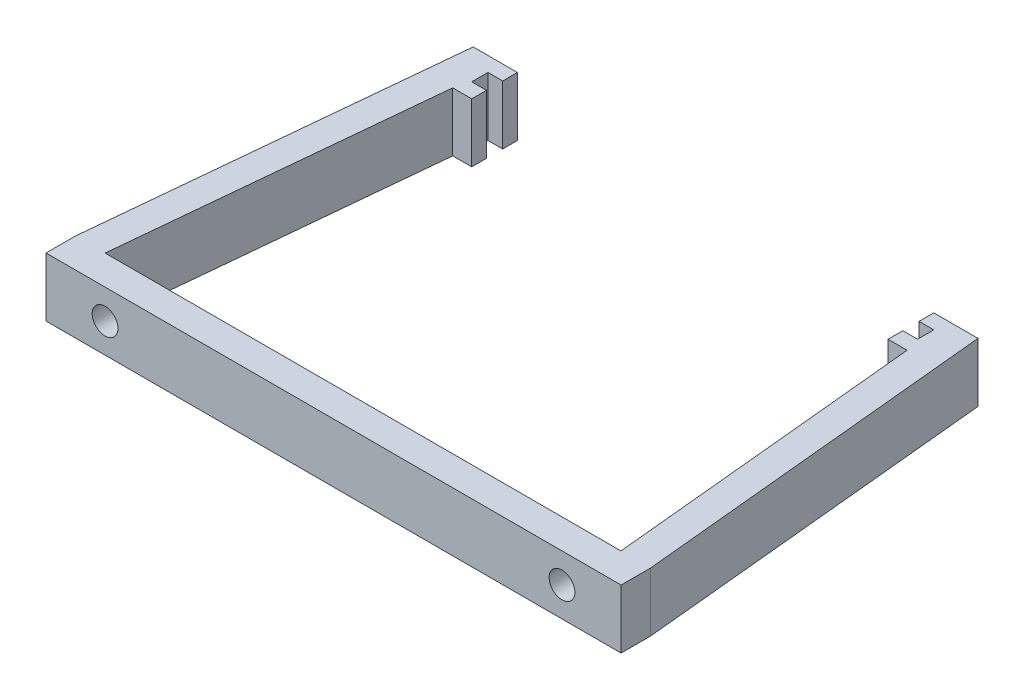
ISO-10303-21;
HEADER;
FILE_DESCRIPTION(('STEP AP214'),'2;1');
FILE_NAME('part.step','',(''),(''),'','','');
FILE_SCHEMA(('AUTOMOTIVE_DESIGN { 1 0 10303 214 1 1 1 1 }'));
ENDSEC;
DATA;
#1=APPLICATION_CONTEXT('core data for automotive mechanical design processes');
#2=APPLICATION_PROTOCOL_DEFINITION('international standard','automotive_design',2000,#1);
#3=PRODUCT_CONTEXT('',#1,'mechanical');
#4=PRODUCT('Part','Part','',(#3));
#5=PRODUCT_RELATED_PRODUCT_CATEGORY('part','',(#4));
#6=PRODUCT_DEFINITION_FORMATION('','',#4);
#7=PRODUCT_DEFINITION_CONTEXT('part definition',#1,'design');
#8=PRODUCT_DEFINITION('design','',#6,#7);
#9=PRODUCT_DEFINITION_SHAPE('','',#8);
#10=(LENGTH_UNIT() NAMED_UNIT(*) SI_UNIT(.MILLI.,.METRE.));
#11=(NAMED_UNIT(*) PLANE_ANGLE_UNIT() SI_UNIT($,.RADIAN.));
#12=(NAMED_UNIT(*) SI_UNIT($,.STERADIAN.) SOLID_ANGLE_UNIT());
#13=UNCERTAINTY_MEASURE_WITH_UNIT(LENGTH_MEASURE(1.E-05),#10,'distance_accuracy_value','');
#14=(GEOMETRIC_REPRESENTATION_CONTEXT(3) GLOBAL_UNCERTAINTY_ASSIGNED_CONTEXT((#13)) GLOBAL_UNIT_ASSIGNED_CONTEXT((#10,
#11,#12)) REPRESENTATION_CONTEXT('',''));
#15=CARTESIAN_POINT('',(0.,0.,0.));
#16=DIRECTION('',(0.,0.,1.));
#17=DIRECTION('',(1.,0.,0.));
#18=AXIS2_PLACEMENT_3D('',#15,#16,#17);
#19=CARTESIAN_POINT('',(0.,0.,4.));
#20=DIRECTION('',(0.,0.,1.));
#21=DIRECTION('',(1.,0.,0.));
#22=AXIS2_PLACEMENT_3D('',#19,#20,#21);
#23=PLANE('',#22);
#24=CARTESIAN_POINT('',(-31.,0.,4.));
#25=DIRECTION('',(0.,0.,1.));
#26=DIRECTION('',(1.,0.,0.));
#27=AXIS2_PLACEMENT_3D('',#24,#25,#26);
#28=CIRCLE('',#27,1.75);
#29=CARTESIAN_POINT('',(-29.25,0.,4.));
#30=VERTEX_POINT('',#29);
#31=EDGE_CURVE('E331',#30,#30,#28,.T.);
#32=ORIENTED_EDGE('',*,*,#31,.F.);
#33=EDGE_LOOP('',(#32));
#34=FACE_BOUND('',#33,.T.);
#35=DIRECTION('',(1.,0.,0.));
#36=VECTOR('',#35,1.);
#37=CARTESIAN_POINT('',(-35.,-4.,4.));
#38=LINE('',#37,#36);
#39=CARTESIAN_POINT('',(-39.0187452660254,-4.,4.));
#40=VERTEX_POINT('',#39);
#41=CARTESIAN_POINT('',(39.0187452660254,-4.,3.99999999999999));
#42=VERTEX_POINT('',#41);
#43=EDGE_CURVE('E11',#40,#42,#38,.T.);
#44=ORIENTED_EDGE('',*,*,#43,.T.);
#45=DIRECTION('',(0.,1.,0.));
#46=VECTOR('',#45,1.);
#47=CARTESIAN_POINT('',(39.0187452660254,-58.2789634628789,3.99999999999999));
#48=LINE('',#47,#46);
#49=CARTESIAN_POINT('',(39.0187452660254,4.,3.99999999999999));
#50=VERTEX_POINT('',#49);
#51=EDGE_CURVE('E234',#42,#50,#48,.T.);
#52=ORIENTED_EDGE('',*,*,#51,.T.);
#53=DIRECTION('',(-1.,0.,0.));
#54=VECTOR('',#53,1.);
#55=CARTESIAN_POINT('',(-35.,4.,4.));
#56=LINE('',#55,#54);
#57=CARTESIAN_POINT('',(-39.0187452660254,4.,4.));
#58=VERTEX_POINT('',#57);
#59=EDGE_CURVE('E42',#50,#58,#56,.T.);
#60=ORIENTED_EDGE('',*,*,#59,.T.);
#61=DIRECTION('',(0.,1.,0.));
#62=VECTOR('',#61,1.);
#63=CARTESIAN_POINT('',(-39.0187452660254,-58.2789634628789,4.));
#64=LINE('',#63,#62);
#65=EDGE_CURVE('E258',#40,#58,#64,.T.);
#66=ORIENTED_EDGE('',*,*,#65,.F.);
#67=EDGE_LOOP('',(#44,#52,#60,#66));
#68=FACE_BOUND('',#67,.T.);
#69=CARTESIAN_POINT('',(31.,0.,4.));
#70=DIRECTION('',(0.,0.,1.));
#71=DIRECTION('',(1.,0.,0.));
#72=AXIS2_PLACEMENT_3D('',#69,#70,#71);
#73=CIRCLE('',#72,1.75);
#74=CARTESIAN_POINT('',(32.75,0.,4.));
#75=VERTEX_POINT('',#74);
#76=EDGE_CURVE('E325',#75,#75,#73,.T.);
#77=ORIENTED_EDGE('',*,*,#76,.F.);
#78=EDGE_LOOP('',(#77));
#79=FACE_BOUND('',#78,.T.);
#80=ADVANCED_FACE('F33',(#34,#68,#79),#23,.T.);
#81=CARTESIAN_POINT('',(0.,0.,0.));
#82=DIRECTION('',(0.,0.,1.));
#83=DIRECTION('',(1.,0.,0.));
#84=AXIS2_PLACEMENT_3D('',#81,#82,#83);
#85=PLANE('',#84);
#86=DIRECTION('',(0.,1.,0.));
#87=VECTOR('',#86,1.);
#88=CARTESIAN_POINT('',(35.,4.,0.));
#89=LINE('',#88,#87);
#90=CARTESIAN_POINT('',(35.,-4.,0.));
#91=VERTEX_POINT('',#90);
#92=CARTESIAN_POINT('',(35.,4.,0.));
#93=VERTEX_POINT('',#92);
#94=EDGE_CURVE('E334',#91,#93,#89,.T.);
#95=ORIENTED_EDGE('',*,*,#94,.F.);
#96=DIRECTION('',(1.,0.,0.));
#97=VECTOR('',#96,1.);
#98=CARTESIAN_POINT('',(-35.,-4.,0.));
#99=LINE('',#98,#97);
#100=CARTESIAN_POINT('',(-35.,-4.,0.));
#101=VERTEX_POINT('',#100);
#102=EDGE_CURVE('E37',#101,#91,#99,.T.);
#103=ORIENTED_EDGE('',*,*,#102,.F.);
#104=DIRECTION('',(0.,-1.,0.));
#105=VECTOR('',#104,1.);
#106=CARTESIAN_POINT('',(-35.,4.,0.));
#107=LINE('',#106,#105);
#108=CARTESIAN_POINT('',(-35.,4.,0.));
#109=VERTEX_POINT('',#108);
#110=EDGE_CURVE('E50',#109,#101,#107,.T.);
#111=ORIENTED_EDGE('',*,*,#110,.F.);
#112=DIRECTION('',(-1.,0.,0.));
#113=VECTOR('',#112,1.);
#114=CARTESIAN_POINT('',(-35.,4.,0.));
#115=LINE('',#114,#113);
#116=EDGE_CURVE('E57',#93,#109,#115,.T.);
#117=ORIENTED_EDGE('',*,*,#116,.F.);
#118=EDGE_LOOP('',(#95,#103,#111,#117));
#119=FACE_BOUND('',#118,.T.);
#120=CARTESIAN_POINT('',(-31.,0.,0.));
#121=DIRECTION('',(0.,0.,1.));
#122=DIRECTION('',(1.,0.,0.));
#123=AXIS2_PLACEMENT_3D('',#120,#121,#122);
#124=CIRCLE('',#123,1.75);
#125=CARTESIAN_POINT('',(-29.25,0.,0.));
#126=VERTEX_POINT('',#125);
#127=EDGE_CURVE('E328',#126,#126,#124,.T.);
#128=ORIENTED_EDGE('',*,*,#127,.T.);
#129=EDGE_LOOP('',(#128));
#130=FACE_BOUND('',#129,.T.);
#131=CARTESIAN_POINT('',(31.,0.,0.));
#132=DIRECTION('',(0.,0.,1.));
#133=DIRECTION('',(1.,0.,0.));
#134=AXIS2_PLACEMENT_3D('',#131,#132,#133);
#135=CIRCLE('',#134,1.75);
#136=CARTESIAN_POINT('',(32.75,0.,0.));
#137=VERTEX_POINT('',#136);
#138=EDGE_CURVE('E324',#137,#137,#135,.T.);
#139=ORIENTED_EDGE('',*,*,#138,.T.);
#140=EDGE_LOOP('',(#139));
#141=FACE_BOUND('',#140,.T.);
#142=ADVANCED_FACE('F395',(#119,#130,#141),#85,.F.);
#143=CARTESIAN_POINT('',(-35.,4.,4.));
#144=DIRECTION('',(0.,-1.,0.));
#145=DIRECTION('',(0.,0.,-1.));
#146=AXIS2_PLACEMENT_3D('',#143,#144,#145);
#147=PLANE('',#146);
#148=ORIENTED_EDGE('',*,*,#116,.T.);
#149=DIRECTION('',(0.0964736109138817,0.,-0.995335542617281));
#150=VECTOR('',#149,1.);
#151=CARTESIAN_POINT('',(-30.8321941780672,4.,-43.));
#152=LINE('',#151,#150);
#153=CARTESIAN_POINT('',(-30.8321941780672,4.,-43.));
#154=VERTEX_POINT('',#153);
#155=EDGE_CURVE('E254',#109,#154,#152,.T.);
#156=ORIENTED_EDGE('',*,*,#155,.T.);
#157=DIRECTION('',(1.,0.,0.));
#158=VECTOR('',#157,1.);
#159=CARTESIAN_POINT('',(-28.25,4.,-43.));
#160=LINE('',#159,#158);
#161=CARTESIAN_POINT('',(-28.25,4.,-43.));
#162=VERTEX_POINT('',#161);
#163=EDGE_CURVE('E277',#154,#162,#160,.T.);
#164=ORIENTED_EDGE('',*,*,#163,.T.);
#165=DIRECTION('',(0.,0.,-1.));
#166=VECTOR('',#165,1.);
#167=CARTESIAN_POINT('',(-28.25,4.,-45.));
#168=LINE('',#167,#166);
#169=CARTESIAN_POINT('',(-28.25,4.,-45.));
#170=VERTEX_POINT('',#169);
#171=EDGE_CURVE('E280',#162,#170,#168,.T.);
#172=ORIENTED_EDGE('',*,*,#171,.T.);
#173=DIRECTION('',(-1.,0.,0.));
#174=VECTOR('',#173,1.);
#175=CARTESIAN_POINT('',(-30.25,4.,-45.));
#176=LINE('',#175,#174);
#177=CARTESIAN_POINT('',(-30.25,4.,-45.));
#178=VERTEX_POINT('',#177);
#179=EDGE_CURVE('E283',#170,#178,#176,.T.);
#180=ORIENTED_EDGE('',*,*,#179,.T.);
#181=DIRECTION('',(0.,0.,-1.));
#182=VECTOR('',#181,1.);
#183=CARTESIAN_POINT('',(-30.25,4.,-47.2));
#184=LINE('',#183,#182);
#185=CARTESIAN_POINT('',(-30.25,4.,-47.2));
#186=VERTEX_POINT('',#185);
#187=EDGE_CURVE('E286',#178,#186,#184,.T.);
#188=ORIENTED_EDGE('',*,*,#187,.T.);
#189=DIRECTION('',(1.,0.,0.));
#190=VECTOR('',#189,1.);
#191=CARTESIAN_POINT('',(-28.25,4.,-47.2));
#192=LINE('',#191,#190);
#193=CARTESIAN_POINT('',(-28.25,4.,-47.2));
#194=VERTEX_POINT('',#193);
#195=EDGE_CURVE('E289',#186,#194,#192,.T.);
#196=ORIENTED_EDGE('',*,*,#195,.T.);
#197=DIRECTION('',(0.,0.,-1.));
#198=VECTOR('',#197,1.);
#199=CARTESIAN_POINT('',(-28.25,4.,-49.2));
#200=LINE('',#199,#198);
#201=CARTESIAN_POINT('',(-28.25,4.,-49.2));
#202=VERTEX_POINT('',#201);
#203=EDGE_CURVE('E292',#194,#202,#200,.T.);
#204=ORIENTED_EDGE('',*,*,#203,.T.);
#205=DIRECTION('',(-1.,0.,0.));
#206=VECTOR('',#205,1.);
#207=CARTESIAN_POINT('',(-34.25,4.,-49.1999999999999));
#208=LINE('',#207,#206);
#209=CARTESIAN_POINT('',(-34.25,4.,-49.1999999999999));
#210=VERTEX_POINT('',#209);
#211=EDGE_CURVE('E295',#202,#210,#208,.T.);
#212=ORIENTED_EDGE('',*,*,#211,.T.);
#213=DIRECTION('',(-0.0964736109138816,0.,0.995335542617281));
#214=VECTOR('',#213,1.);
#215=CARTESIAN_POINT('',(-39.0187452660254,4.,0.));
#216=LINE('',#215,#214);
#217=CARTESIAN_POINT('',(-39.0187452660254,4.,0.));
#218=VERTEX_POINT('',#217);
#219=EDGE_CURVE('E298',#210,#218,#216,.T.);
#220=ORIENTED_EDGE('',*,*,#219,.T.);
#221=DIRECTION('',(0.,0.,1.));
#222=VECTOR('',#221,1.);
#223=CARTESIAN_POINT('',(-39.0187452660254,4.,0.));
#224=LINE('',#223,#222);
#225=EDGE_CURVE('E301',#218,#58,#224,.T.);
#226=ORIENTED_EDGE('',*,*,#225,.T.);
#227=ORIENTED_EDGE('',*,*,#59,.F.);
#228=DIRECTION('',(0.,0.,-1.));
#229=VECTOR('',#228,1.);
#230=CARTESIAN_POINT('',(39.0187452660254,4.,0.));
#231=LINE('',#230,#229);
#232=CARTESIAN_POINT('',(39.0187452660254,4.,0.));
#233=VERTEX_POINT('',#232);
#234=EDGE_CURVE('E190',#50,#233,#231,.T.);
#235=ORIENTED_EDGE('',*,*,#234,.T.);
#236=DIRECTION('',(-0.0964736109138818,0.,-0.995335542617281));
#237=VECTOR('',#236,1.);
#238=CARTESIAN_POINT('',(39.0187452660254,4.,0.));
#239=LINE('',#238,#237);
#240=CARTESIAN_POINT('',(34.25,4.,-49.2));
#241=VERTEX_POINT('',#240);
#242=EDGE_CURVE('E199',#233,#241,#239,.T.);
#243=ORIENTED_EDGE('',*,*,#242,.T.);
#244=DIRECTION('',(-1.,0.,0.));
#245=VECTOR('',#244,1.);
#246=CARTESIAN_POINT('',(34.25,4.,-49.2));
#247=LINE('',#246,#245);
#248=CARTESIAN_POINT('',(28.25,4.,-49.2));
#249=VERTEX_POINT('',#248);
#250=EDGE_CURVE('E205',#241,#249,#247,.T.);
#251=ORIENTED_EDGE('',*,*,#250,.T.);
#252=DIRECTION('',(0.,0.,1.));
#253=VECTOR('',#252,1.);
#254=CARTESIAN_POINT('',(28.25,4.,-49.2));
#255=LINE('',#254,#253);
#256=CARTESIAN_POINT('',(28.25,4.,-47.2));
#257=VERTEX_POINT('',#256);
#258=EDGE_CURVE('E214',#249,#257,#255,.T.);
#259=ORIENTED_EDGE('',*,*,#258,.T.);
#260=DIRECTION('',(1.,0.,0.));
#261=VECTOR('',#260,1.);
#262=CARTESIAN_POINT('',(28.25,4.,-47.2));
#263=LINE('',#262,#261);
#264=CARTESIAN_POINT('',(30.25,4.,-47.2));
#265=VERTEX_POINT('',#264);
#266=EDGE_CURVE('E217',#257,#265,#263,.T.);
#267=ORIENTED_EDGE('',*,*,#266,.T.);
#268=DIRECTION('',(0.,0.,1.));
#269=VECTOR('',#268,1.);
#270=CARTESIAN_POINT('',(30.25,4.,-47.2));
#271=LINE('',#270,#269);
#272=CARTESIAN_POINT('',(30.25,4.,-45.));
#273=VERTEX_POINT('',#272);
#274=EDGE_CURVE('E220',#265,#273,#271,.T.);
#275=ORIENTED_EDGE('',*,*,#274,.T.);
#276=DIRECTION('',(-1.,0.,0.));
#277=VECTOR('',#276,1.);
#278=CARTESIAN_POINT('',(30.25,4.,-45.));
#279=LINE('',#278,#277);
#280=CARTESIAN_POINT('',(28.25,4.,-45.));
#281=VERTEX_POINT('',#280);
#282=EDGE_CURVE('E223',#273,#281,#279,.T.);
#283=ORIENTED_EDGE('',*,*,#282,.T.);
#284=DIRECTION('',(0.,0.,1.));
#285=VECTOR('',#284,1.);
#286=CARTESIAN_POINT('',(28.25,4.,-45.));
#287=LINE('',#286,#285);
#288=CARTESIAN_POINT('',(28.25,4.,-43.));
#289=VERTEX_POINT('',#288);
#290=EDGE_CURVE('E226',#281,#289,#287,.T.);
#291=ORIENTED_EDGE('',*,*,#290,.T.);
#292=DIRECTION('',(1.,0.,0.));
#293=VECTOR('',#292,1.);
#294=CARTESIAN_POINT('',(28.25,4.,-43.));
#295=LINE('',#294,#293);
#296=CARTESIAN_POINT('',(30.8321941780672,4.,-43.));
#297=VERTEX_POINT('',#296);
#298=EDGE_CURVE('E229',#289,#297,#295,.T.);
#299=ORIENTED_EDGE('',*,*,#298,.T.);
#300=DIRECTION('',(0.0964736109138817,0.,0.995335542617281));
#301=VECTOR('',#300,1.);
#302=CARTESIAN_POINT('',(30.8321941780672,4.,-43.));
#303=LINE('',#302,#301);
#304=EDGE_CURVE('E196',#297,#93,#303,.T.);
#305=ORIENTED_EDGE('',*,*,#304,.T.);
#306=EDGE_LOOP('',(#148,#156,#164,#172,#180,#188,#196,#204,#212,#220,#226,#227,#235,#243,#251,
#259,#267,#275,#283,#291,#299,#305));
#307=FACE_BOUND('',#306,.T.);
#308=ADVANCED_FACE('F35',(#307),#147,.F.);
#309=CARTESIAN_POINT('',(-35.,-4.,4.));
#310=DIRECTION('',(0.,1.,0.));
#311=DIRECTION('',(0.,0.,1.));
#312=AXIS2_PLACEMENT_3D('',#309,#310,#311);
#313=PLANE('',#312);
#314=ORIENTED_EDGE('',*,*,#102,.T.);
#315=DIRECTION('',(-0.0964736109138817,0.,-0.995335542617281));
#316=VECTOR('',#315,1.);
#317=CARTESIAN_POINT('',(30.8321941780672,-4.,-43.));
#318=LINE('',#317,#316);
#319=CARTESIAN_POINT('',(30.8321941780672,-4.,-43.));
#320=VERTEX_POINT('',#319);
#321=EDGE_CURVE('E344',#91,#320,#318,.T.);
#322=ORIENTED_EDGE('',*,*,#321,.T.);
#323=DIRECTION('',(-1.,0.,0.));
#324=VECTOR('',#323,1.);
#325=CARTESIAN_POINT('',(28.25,-4.,-43.));
#326=LINE('',#325,#324);
#327=CARTESIAN_POINT('',(28.25,-4.,-43.));
#328=VERTEX_POINT('',#327);
#329=EDGE_CURVE('E350',#320,#328,#326,.T.);
#330=ORIENTED_EDGE('',*,*,#329,.T.);
#331=DIRECTION('',(0.,0.,-1.));
#332=VECTOR('',#331,1.);
#333=CARTESIAN_POINT('',(28.25,-4.,-45.));
#334=LINE('',#333,#332);
#335=CARTESIAN_POINT('',(28.25,-4.,-45.));
#336=VERTEX_POINT('',#335);
#337=EDGE_CURVE('E351',#328,#336,#334,.T.);
#338=ORIENTED_EDGE('',*,*,#337,.T.);
#339=DIRECTION('',(1.,0.,0.));
#340=VECTOR('',#339,1.);
#341=CARTESIAN_POINT('',(30.25,-4.,-45.));
#342=LINE('',#341,#340);
#343=CARTESIAN_POINT('',(30.25,-4.,-45.));
#344=VERTEX_POINT('',#343);
#345=EDGE_CURVE('E355',#336,#344,#342,.T.);
#346=ORIENTED_EDGE('',*,*,#345,.T.);
#347=DIRECTION('',(0.,0.,-1.));
#348=VECTOR('',#347,1.);
#349=CARTESIAN_POINT('',(30.25,-4.,-47.2));
#350=LINE('',#349,#348);
#351=CARTESIAN_POINT('',(30.25,-4.,-47.2));
#352=VERTEX_POINT('',#351);
#353=EDGE_CURVE('E357',#344,#352,#350,.T.);
#354=ORIENTED_EDGE('',*,*,#353,.T.);
#355=DIRECTION('',(-1.,0.,0.));
#356=VECTOR('',#355,1.);
#357=CARTESIAN_POINT('',(28.25,-4.,-47.2));
#358=LINE('',#357,#356);
#359=CARTESIAN_POINT('',(28.25,-4.,-47.2));
#360=VERTEX_POINT('',#359);
#361=EDGE_CURVE('E359',#352,#360,#358,.T.);
#362=ORIENTED_EDGE('',*,*,#361,.T.);
#363=DIRECTION('',(0.,0.,-1.));
#364=VECTOR('',#363,1.);
#365=CARTESIAN_POINT('',(28.25,-4.,-49.2));
#366=LINE('',#365,#364);
#367=CARTESIAN_POINT('',(28.25,-4.,-49.2));
#368=VERTEX_POINT('',#367);
#369=EDGE_CURVE('E361',#360,#368,#366,.T.);
#370=ORIENTED_EDGE('',*,*,#369,.T.);
#371=DIRECTION('',(1.,0.,0.));
#372=VECTOR('',#371,1.);
#373=CARTESIAN_POINT('',(34.25,-4.,-49.2));
#374=LINE('',#373,#372);
#375=CARTESIAN_POINT('',(34.25,-4.,-49.2));
#376=VERTEX_POINT('',#375);
#377=EDGE_CURVE('E236',#368,#376,#374,.T.);
#378=ORIENTED_EDGE('',*,*,#377,.T.);
#379=DIRECTION('',(0.0964736109138819,0.,0.995335542617281));
#380=VECTOR('',#379,1.);
#381=CARTESIAN_POINT('',(39.0187452660254,-4.,0.));
#382=LINE('',#381,#380);
#383=CARTESIAN_POINT('',(39.0187452660254,-4.,0.));
#384=VERTEX_POINT('',#383);
#385=EDGE_CURVE('E252',#376,#384,#382,.T.);
#386=ORIENTED_EDGE('',*,*,#385,.T.);
#387=DIRECTION('',(0.,0.,1.));
#388=VECTOR('',#387,1.);
#389=CARTESIAN_POINT('',(39.0187452660254,-4.,0.));
#390=LINE('',#389,#388);
#391=EDGE_CURVE('E192',#384,#42,#390,.T.);
#392=ORIENTED_EDGE('',*,*,#391,.T.);
#393=ORIENTED_EDGE('',*,*,#43,.F.);
#394=DIRECTION('',(0.,0.,-1.));
#395=VECTOR('',#394,1.);
#396=CARTESIAN_POINT('',(-39.0187452660254,-4.,0.));
#397=LINE('',#396,#395);
#398=CARTESIAN_POINT('',(-39.0187452660254,-4.,0.));
#399=VERTEX_POINT('',#398);
#400=EDGE_CURVE('E270',#40,#399,#397,.T.);
#401=ORIENTED_EDGE('',*,*,#400,.T.);
#402=DIRECTION('',(0.0964736109138816,0.,-0.995335542617281));
#403=VECTOR('',#402,1.);
#404=CARTESIAN_POINT('',(-39.0187452660254,-4.,0.));
#405=LINE('',#404,#403);
#406=CARTESIAN_POINT('',(-34.25,-4.,-49.1999999999999));
#407=VERTEX_POINT('',#406);
#408=EDGE_CURVE('E268',#399,#407,#405,.T.);
#409=ORIENTED_EDGE('',*,*,#408,.T.);
#410=DIRECTION('',(1.,0.,0.));
#411=VECTOR('',#410,1.);
#412=CARTESIAN_POINT('',(-34.25,-4.,-49.1999999999999));
#413=LINE('',#412,#411);
#414=CARTESIAN_POINT('',(-28.25,-4.,-49.2));
#415=VERTEX_POINT('',#414);
#416=EDGE_CURVE('E266',#407,#415,#413,.T.);
#417=ORIENTED_EDGE('',*,*,#416,.T.);
#418=DIRECTION('',(0.,0.,1.));
#419=VECTOR('',#418,1.);
#420=CARTESIAN_POINT('',(-28.25,-4.,-49.2));
#421=LINE('',#420,#419);
#422=CARTESIAN_POINT('',(-28.25,-4.,-47.2));
#423=VERTEX_POINT('',#422);
#424=EDGE_CURVE('E264',#415,#423,#421,.T.);
#425=ORIENTED_EDGE('',*,*,#424,.T.);
#426=DIRECTION('',(-1.,0.,0.));
#427=VECTOR('',#426,1.);
#428=CARTESIAN_POINT('',(-28.25,-4.,-47.2));
#429=LINE('',#428,#427);
#430=CARTESIAN_POINT('',(-30.25,-4.,-47.2));
#431=VERTEX_POINT('',#430);
#432=EDGE_CURVE('E262',#423,#431,#429,.T.);
#433=ORIENTED_EDGE('',*,*,#432,.T.);
#434=DIRECTION('',(0.,0.,1.));
#435=VECTOR('',#434,1.);
#436=CARTESIAN_POINT('',(-30.25,-4.,-47.2));
#437=LINE('',#436,#435);
#438=CARTESIAN_POINT('',(-30.25,-4.,-45.));
#439=VERTEX_POINT('',#438);
#440=EDGE_CURVE('E260',#431,#439,#437,.T.);
#441=ORIENTED_EDGE('',*,*,#440,.T.);
#442=DIRECTION('',(1.,0.,0.));
#443=VECTOR('',#442,1.);
#444=CARTESIAN_POINT('',(-30.25,-4.,-45.));
#445=LINE('',#444,#443);
#446=CARTESIAN_POINT('',(-28.25,-4.,-45.));
#447=VERTEX_POINT('',#446);
#448=EDGE_CURVE('E257',#439,#447,#445,.T.);
#449=ORIENTED_EDGE('',*,*,#448,.T.);
#450=DIRECTION('',(0.,0.,1.));
#451=VECTOR('',#450,1.);
#452=CARTESIAN_POINT('',(-28.25,-4.,-45.));
#453=LINE('',#452,#451);
#454=CARTESIAN_POINT('',(-28.25,-4.,-43.));
#455=VERTEX_POINT('',#454);
#456=EDGE_CURVE('E255',#447,#455,#453,.T.);
#457=ORIENTED_EDGE('',*,*,#456,.T.);
#458=DIRECTION('',(-1.,0.,0.));
#459=VECTOR('',#458,1.);
#460=CARTESIAN_POINT('',(-28.25,-4.,-43.));
#461=LINE('',#460,#459);
#462=CARTESIAN_POINT('',(-30.8321941780672,-4.,-43.));
#463=VERTEX_POINT('',#462);
#464=EDGE_CURVE('E274',#455,#463,#461,.T.);
#465=ORIENTED_EDGE('',*,*,#464,.T.);
#466=DIRECTION('',(-0.0964736109138817,0.,0.995335542617281));
#467=VECTOR('',#466,1.);
#468=CARTESIAN_POINT('',(-30.8321941780672,-4.,-43.));
#469=LINE('',#468,#467);
#470=EDGE_CURVE('E272',#463,#101,#469,.T.);
#471=ORIENTED_EDGE('',*,*,#470,.T.);
#472=EDGE_LOOP('',(#314,#322,#330,#338,#346,#354,#362,#370,#378,#386,#392,#393,#401,#409,#417,
#425,#433,#441,#449,#457,#465,#471));
#473=FACE_BOUND('',#472,.T.);
#474=ADVANCED_FACE('F343',(#473),#313,.F.);
#475=CARTESIAN_POINT('',(-31.,0.,4.));
#476=DIRECTION('',(0.,0.,-1.));
#477=DIRECTION('',(-1.,0.,0.));
#478=AXIS2_PLACEMENT_3D('',#475,#476,#477);
#479=CYLINDRICAL_SURFACE('',#478,1.75);
#480=ORIENTED_EDGE('',*,*,#31,.T.);
#481=EDGE_LOOP('',(#480));
#482=FACE_BOUND('',#481,.T.);
#483=ORIENTED_EDGE('',*,*,#127,.F.);
#484=EDGE_LOOP('',(#483));
#485=FACE_BOUND('',#484,.T.);
#486=ADVANCED_FACE('F406',(#482,#485),#479,.F.);
#487=CARTESIAN_POINT('',(31.,0.,4.));
#488=DIRECTION('',(0.,0.,-1.));
#489=DIRECTION('',(-1.,0.,0.));
#490=AXIS2_PLACEMENT_3D('',#487,#488,#489);
#491=CYLINDRICAL_SURFACE('',#490,1.75);
#492=ORIENTED_EDGE('',*,*,#76,.T.);
#493=EDGE_LOOP('',(#492));
#494=FACE_BOUND('',#493,.T.);
#495=ORIENTED_EDGE('',*,*,#138,.F.);
#496=EDGE_LOOP('',(#495));
#497=FACE_BOUND('',#496,.T.);
#498=ADVANCED_FACE('F403',(#494,#497),#491,.F.);
#499=CARTESIAN_POINT('',(-30.8321941780672,-58.2789634628789,-43.));
#500=DIRECTION('',(0.995335542617281,0.,0.0964736109138817));
#501=DIRECTION('',(0.0964736109138817,0.,-0.995335542617281));
#502=AXIS2_PLACEMENT_3D('',#499,#500,#501);
#503=PLANE('',#502);
#504=ORIENTED_EDGE('',*,*,#470,.F.);
#505=DIRECTION('',(0.,1.,0.));
#506=VECTOR('',#505,1.);
#507=CARTESIAN_POINT('',(-30.8321941780672,-58.2789634628789,-43.));
#508=LINE('',#507,#506);
#509=EDGE_CURVE('E303',#463,#154,#508,.T.);
#510=ORIENTED_EDGE('',*,*,#509,.T.);
#511=ORIENTED_EDGE('',*,*,#155,.F.);
#512=ORIENTED_EDGE('',*,*,#110,.T.);
#513=EDGE_LOOP('',(#504,#510,#511,#512));
#514=FACE_BOUND('',#513,.T.);
#515=ADVANCED_FACE('F405',(#514),#503,.T.);
#516=CARTESIAN_POINT('',(-39.0187452660254,-58.2789634628789,0.));
#517=DIRECTION('',(-1.,0.,0.));
#518=DIRECTION('',(0.,0.,1.));
#519=AXIS2_PLACEMENT_3D('',#516,#517,#518);
#520=PLANE('',#519);
#521=ORIENTED_EDGE('',*,*,#400,.F.);
#522=ORIENTED_EDGE('',*,*,#65,.T.);
#523=ORIENTED_EDGE('',*,*,#225,.F.);
#524=DIRECTION('',(0.,1.,0.));
#525=VECTOR('',#524,1.);
#526=CARTESIAN_POINT('',(-39.0187452660254,-58.2789634628789,0.));
#527=LINE('',#526,#525);
#528=EDGE_CURVE('E306',#399,#218,#527,.T.);
#529=ORIENTED_EDGE('',*,*,#528,.F.);
#530=EDGE_LOOP('',(#521,#522,#523,#529));
#531=FACE_BOUND('',#530,.T.);
#532=ADVANCED_FACE('F413',(#531),#520,.T.);
#533=CARTESIAN_POINT('',(-39.0187452660254,-58.2789634628789,0.));
#534=DIRECTION('',(-0.995335542617281,0.,-0.0964736109138816));
#535=DIRECTION('',(-0.0964736109138816,0.,0.995335542617281));
#536=AXIS2_PLACEMENT_3D('',#533,#534,#535);
#537=PLANE('',#536);
#538=ORIENTED_EDGE('',*,*,#408,.F.);
#539=ORIENTED_EDGE('',*,*,#528,.T.);
#540=ORIENTED_EDGE('',*,*,#219,.F.);
#541=DIRECTION('',(0.,1.,0.));
#542=VECTOR('',#541,1.);
#543=CARTESIAN_POINT('',(-34.25,-58.2789634628789,-49.1999999999999));
#544=LINE('',#543,#542);
#545=EDGE_CURVE('E308',#407,#210,#544,.T.);
#546=ORIENTED_EDGE('',*,*,#545,.F.);
#547=EDGE_LOOP('',(#538,#539,#540,#546));
#548=FACE_BOUND('',#547,.T.);
#549=ADVANCED_FACE('F483',(#548),#537,.T.);
#550=CARTESIAN_POINT('',(-34.25,-58.2789634628789,-49.1999999999999));
#551=DIRECTION('',(0.,0.,-1.));
#552=DIRECTION('',(-1.,0.,0.));
#553=AXIS2_PLACEMENT_3D('',#550,#551,#552);
#554=PLANE('',#553);
#555=ORIENTED_EDGE('',*,*,#416,.F.);
#556=ORIENTED_EDGE('',*,*,#545,.T.);
#557=ORIENTED_EDGE('',*,*,#211,.F.);
#558=DIRECTION('',(0.,1.,0.));
#559=VECTOR('',#558,1.);
#560=CARTESIAN_POINT('',(-28.25,-58.2789634628789,-49.2));
#561=LINE('',#560,#559);
#562=EDGE_CURVE('E310',#415,#202,#561,.T.);
#563=ORIENTED_EDGE('',*,*,#562,.F.);
#564=EDGE_LOOP('',(#555,#556,#557,#563));
#565=FACE_BOUND('',#564,.T.);
#566=ADVANCED_FACE('F492',(#565),#554,.T.);
#567=CARTESIAN_POINT('',(-28.25,-58.2789634628789,-49.2));
#568=DIRECTION('',(1.,0.,0.));
#569=DIRECTION('',(0.,0.,-1.));
#570=AXIS2_PLACEMENT_3D('',#567,#568,#569);
#571=PLANE('',#570);
#572=ORIENTED_EDGE('',*,*,#424,.F.);
#573=ORIENTED_EDGE('',*,*,#562,.T.);
#574=ORIENTED_EDGE('',*,*,#203,.F.);
#575=DIRECTION('',(0.,1.,0.));
#576=VECTOR('',#575,1.);
#577=CARTESIAN_POINT('',(-28.25,-58.2789634628789,-47.2));
#578=LINE('',#577,#576);
#579=EDGE_CURVE('E312',#423,#194,#578,.T.);
#580=ORIENTED_EDGE('',*,*,#579,.F.);
#581=EDGE_LOOP('',(#572,#573,#574,#580));
#582=FACE_BOUND('',#581,.T.);
#583=ADVANCED_FACE('F501',(#582),#571,.T.);
#584=CARTESIAN_POINT('',(-28.25,-58.2789634628789,-47.2));
#585=DIRECTION('',(0.,0.,1.));
#586=DIRECTION('',(1.,0.,0.));
#587=AXIS2_PLACEMENT_3D('',#584,#585,#586);
#588=PLANE('',#587);
#589=ORIENTED_EDGE('',*,*,#432,.F.);
#590=ORIENTED_EDGE('',*,*,#579,.T.);
#591=ORIENTED_EDGE('',*,*,#195,.F.);
#592=DIRECTION('',(0.,1.,0.));
#593=VECTOR('',#592,1.);
#594=CARTESIAN_POINT('',(-30.25,-58.2789634628789,-47.2));
#595=LINE('',#594,#593);
#596=EDGE_CURVE('E314',#431,#186,#595,.T.);
#597=ORIENTED_EDGE('',*,*,#596,.F.);
#598=EDGE_LOOP('',(#589,#590,#591,#597));
#599=FACE_BOUND('',#598,.T.);
#600=ADVANCED_FACE('F510',(#599),#588,.T.);
#601=CARTESIAN_POINT('',(-30.25,-58.2789634628789,-47.2));
#602=DIRECTION('',(1.,0.,0.));
#603=DIRECTION('',(0.,0.,-1.));
#604=AXIS2_PLACEMENT_3D('',#601,#602,#603);
#605=PLANE('',#604);
#606=ORIENTED_EDGE('',*,*,#440,.F.);
#607=ORIENTED_EDGE('',*,*,#596,.T.);
#608=ORIENTED_EDGE('',*,*,#187,.F.);
#609=DIRECTION('',(0.,1.,0.));
#610=VECTOR('',#609,1.);
#611=CARTESIAN_POINT('',(-30.25,-58.2789634628789,-45.));
#612=LINE('',#611,#610);
#613=EDGE_CURVE('E316',#439,#178,#612,.T.);
#614=ORIENTED_EDGE('',*,*,#613,.F.);
#615=EDGE_LOOP('',(#606,#607,#608,#614));
#616=FACE_BOUND('',#615,.T.);
#617=ADVANCED_FACE('F519',(#616),#605,.T.);
#618=CARTESIAN_POINT('',(-30.25,-58.2789634628789,-45.));
#619=DIRECTION('',(0.,0.,-1.));
#620=DIRECTION('',(-1.,0.,0.));
#621=AXIS2_PLACEMENT_3D('',#618,#619,#620);
#622=PLANE('',#621);
#623=ORIENTED_EDGE('',*,*,#448,.F.);
#624=ORIENTED_EDGE('',*,*,#613,.T.);
#625=ORIENTED_EDGE('',*,*,#179,.F.);
#626=DIRECTION('',(0.,1.,0.));
#627=VECTOR('',#626,1.);
#628=CARTESIAN_POINT('',(-28.25,-58.2789634628789,-45.));
#629=LINE('',#628,#627);
#630=EDGE_CURVE('E318',#447,#170,#629,.T.);
#631=ORIENTED_EDGE('',*,*,#630,.F.);
#632=EDGE_LOOP('',(#623,#624,#625,#631));
#633=FACE_BOUND('',#632,.T.);
#634=ADVANCED_FACE('F528',(#633),#622,.T.);
#635=CARTESIAN_POINT('',(-28.25,-58.2789634628789,-45.));
#636=DIRECTION('',(1.,0.,0.));
#637=DIRECTION('',(0.,0.,-1.));
#638=AXIS2_PLACEMENT_3D('',#635,#636,#637);
#639=PLANE('',#638);
#640=ORIENTED_EDGE('',*,*,#456,.F.);
#641=ORIENTED_EDGE('',*,*,#630,.T.);
#642=ORIENTED_EDGE('',*,*,#171,.F.);
#643=DIRECTION('',(0.,1.,0.));
#644=VECTOR('',#643,1.);
#645=CARTESIAN_POINT('',(-28.25,-58.2789634628789,-43.));
#646=LINE('',#645,#644);
#647=EDGE_CURVE('E320',#455,#162,#646,.T.);
#648=ORIENTED_EDGE('',*,*,#647,.F.);
#649=EDGE_LOOP('',(#640,#641,#642,#648));
#650=FACE_BOUND('',#649,.T.);
#651=ADVANCED_FACE('F537',(#650),#639,.T.);
#652=CARTESIAN_POINT('',(-28.25,-58.2789634628789,-43.));
#653=DIRECTION('',(0.,0.,1.));
#654=DIRECTION('',(1.,0.,0.));
#655=AXIS2_PLACEMENT_3D('',#652,#653,#654);
#656=PLANE('',#655);
#657=ORIENTED_EDGE('',*,*,#464,.F.);
#658=ORIENTED_EDGE('',*,*,#647,.T.);
#659=ORIENTED_EDGE('',*,*,#163,.F.);
#660=ORIENTED_EDGE('',*,*,#509,.F.);
#661=EDGE_LOOP('',(#657,#658,#659,#660));
#662=FACE_BOUND('',#661,.T.);
#663=ADVANCED_FACE('F546',(#662),#656,.T.);
#664=CARTESIAN_POINT('',(39.0187452660254,-58.2789634628789,0.));
#665=DIRECTION('',(1.,0.,0.));
#666=DIRECTION('',(0.,0.,-1.));
#667=AXIS2_PLACEMENT_3D('',#664,#665,#666);
#668=PLANE('',#667);
#669=ORIENTED_EDGE('',*,*,#391,.F.);
#670=DIRECTION('',(0.,1.,0.));
#671=VECTOR('',#670,1.);
#672=CARTESIAN_POINT('',(39.0187452660254,-58.2789634628789,0.));
#673=LINE('',#672,#671);
#674=EDGE_CURVE('E185',#384,#233,#673,.T.);
#675=ORIENTED_EDGE('',*,*,#674,.T.);
#676=ORIENTED_EDGE('',*,*,#234,.F.);
#677=ORIENTED_EDGE('',*,*,#51,.F.);
#678=EDGE_LOOP('',(#669,#675,#676,#677));
#679=FACE_BOUND('',#678,.T.);
#680=ADVANCED_FACE('F187',(#679),#668,.T.);
#681=CARTESIAN_POINT('',(30.8321941780672,-58.2789634628789,-43.));
#682=DIRECTION('',(-0.995335542617281,0.,0.0964736109138817));
#683=DIRECTION('',(0.0964736109138817,0.,0.995335542617281));
#684=AXIS2_PLACEMENT_3D('',#681,#682,#683);
#685=PLANE('',#684);
#686=ORIENTED_EDGE('',*,*,#321,.F.);
#687=ORIENTED_EDGE('',*,*,#94,.T.);
#688=ORIENTED_EDGE('',*,*,#304,.F.);
#689=DIRECTION('',(0.,1.,0.));
#690=VECTOR('',#689,1.);
#691=CARTESIAN_POINT('',(30.8321941780672,-58.2789634628789,-43.));
#692=LINE('',#691,#690);
#693=EDGE_CURVE('E237',#320,#297,#692,.T.);
#694=ORIENTED_EDGE('',*,*,#693,.F.);
#695=EDGE_LOOP('',(#686,#687,#688,#694));
#696=FACE_BOUND('',#695,.T.);
#697=ADVANCED_FACE('F348',(#696),#685,.T.);
#698=CARTESIAN_POINT('',(28.25,-58.2789634628789,-43.));
#699=DIRECTION('',(0.,0.,1.));
#700=DIRECTION('',(1.,0.,0.));
#701=AXIS2_PLACEMENT_3D('',#698,#699,#700);
#702=PLANE('',#701);
#703=ORIENTED_EDGE('',*,*,#329,.F.);
#704=ORIENTED_EDGE('',*,*,#693,.T.);
#705=ORIENTED_EDGE('',*,*,#298,.F.);
#706=DIRECTION('',(0.,1.,0.));
#707=VECTOR('',#706,1.);
#708=CARTESIAN_POINT('',(28.25,-58.2789634628789,-43.));
#709=LINE('',#708,#707);
#710=EDGE_CURVE('E239',#328,#289,#709,.T.);
#711=ORIENTED_EDGE('',*,*,#710,.F.);
#712=EDGE_LOOP('',(#703,#704,#705,#711));
#713=FACE_BOUND('',#712,.T.);
#714=ADVANCED_FACE('F394',(#713),#702,.T.);
#715=CARTESIAN_POINT('',(28.25,-58.2789634628789,-45.));
#716=DIRECTION('',(-1.,0.,0.));
#717=DIRECTION('',(0.,0.,1.));
#718=AXIS2_PLACEMENT_3D('',#715,#716,#717);
#719=PLANE('',#718);
#720=ORIENTED_EDGE('',*,*,#337,.F.);
#721=ORIENTED_EDGE('',*,*,#710,.T.);
#722=ORIENTED_EDGE('',*,*,#290,.F.);
#723=DIRECTION('',(0.,1.,0.));
#724=VECTOR('',#723,1.);
#725=CARTESIAN_POINT('',(28.25,-58.2789634628789,-45.));
#726=LINE('',#725,#724);
#727=EDGE_CURVE('E241',#336,#281,#726,.T.);
#728=ORIENTED_EDGE('',*,*,#727,.F.);
#729=EDGE_LOOP('',(#720,#721,#722,#728));
#730=FACE_BOUND('',#729,.T.);
#731=ADVANCED_FACE('F390',(#730),#719,.T.);
#732=CARTESIAN_POINT('',(30.25,-58.2789634628789,-45.));
#733=DIRECTION('',(0.,0.,-1.));
#734=DIRECTION('',(-1.,0.,0.));
#735=AXIS2_PLACEMENT_3D('',#732,#733,#734);
#736=PLANE('',#735);
#737=ORIENTED_EDGE('',*,*,#345,.F.);
#738=ORIENTED_EDGE('',*,*,#727,.T.);
#739=ORIENTED_EDGE('',*,*,#282,.F.);
#740=DIRECTION('',(0.,1.,0.));
#741=VECTOR('',#740,1.);
#742=CARTESIAN_POINT('',(30.25,-58.2789634628789,-45.));
#743=LINE('',#742,#741);
#744=EDGE_CURVE('E243',#344,#273,#743,.T.);
#745=ORIENTED_EDGE('',*,*,#744,.F.);
#746=EDGE_LOOP('',(#737,#738,#739,#745));
#747=FACE_BOUND('',#746,.T.);
#748=ADVANCED_FACE('F386',(#747),#736,.T.);
#749=CARTESIAN_POINT('',(30.25,-58.2789634628789,-47.2));
#750=DIRECTION('',(-1.,0.,0.));
#751=DIRECTION('',(0.,0.,1.));
#752=AXIS2_PLACEMENT_3D('',#749,#750,#751);
#753=PLANE('',#752);
#754=ORIENTED_EDGE('',*,*,#353,.F.);
#755=ORIENTED_EDGE('',*,*,#744,.T.);
#756=ORIENTED_EDGE('',*,*,#274,.F.);
#757=DIRECTION('',(0.,1.,0.));
#758=VECTOR('',#757,1.);
#759=CARTESIAN_POINT('',(30.25,-58.2789634628789,-47.2));
#760=LINE('',#759,#758);
#761=EDGE_CURVE('E245',#352,#265,#760,.T.);
#762=ORIENTED_EDGE('',*,*,#761,.F.);
#763=EDGE_LOOP('',(#754,#755,#756,#762));
#764=FACE_BOUND('',#763,.T.);
#765=ADVANCED_FACE('F380',(#764),#753,.T.);
#766=CARTESIAN_POINT('',(28.25,-58.2789634628789,-47.2));
#767=DIRECTION('',(0.,0.,1.));
#768=DIRECTION('',(1.,0.,0.));
#769=AXIS2_PLACEMENT_3D('',#766,#767,#768);
#770=PLANE('',#769);
#771=ORIENTED_EDGE('',*,*,#361,.F.);
#772=ORIENTED_EDGE('',*,*,#761,.T.);
#773=ORIENTED_EDGE('',*,*,#266,.F.);
#774=DIRECTION('',(0.,1.,0.));
#775=VECTOR('',#774,1.);
#776=CARTESIAN_POINT('',(28.25,-58.2789634628789,-47.2));
#777=LINE('',#776,#775);
#778=EDGE_CURVE('E247',#360,#257,#777,.T.);
#779=ORIENTED_EDGE('',*,*,#778,.F.);
#780=EDGE_LOOP('',(#771,#772,#773,#779));
#781=FACE_BOUND('',#780,.T.);
#782=ADVANCED_FACE('F375',(#781),#770,.T.);
#783=CARTESIAN_POINT('',(28.25,-58.2789634628789,-49.2));
#784=DIRECTION('',(-1.,0.,0.));
#785=DIRECTION('',(0.,0.,1.));
#786=AXIS2_PLACEMENT_3D('',#783,#784,#785);
#787=PLANE('',#786);
#788=ORIENTED_EDGE('',*,*,#369,.F.);
#789=ORIENTED_EDGE('',*,*,#778,.T.);
#790=ORIENTED_EDGE('',*,*,#258,.F.);
#791=DIRECTION('',(0.,1.,0.));
#792=VECTOR('',#791,1.);
#793=CARTESIAN_POINT('',(28.25,-58.2789634628789,-49.2));
#794=LINE('',#793,#792);
#795=EDGE_CURVE('E249',#368,#249,#794,.T.);
#796=ORIENTED_EDGE('',*,*,#795,.F.);
#797=EDGE_LOOP('',(#788,#789,#790,#796));
#798=FACE_BOUND('',#797,.T.);
#799=ADVANCED_FACE('F371',(#798),#787,.T.);
#800=CARTESIAN_POINT('',(34.25,-58.2789634628789,-49.2));
#801=DIRECTION('',(0.,0.,-1.));
#802=DIRECTION('',(-1.,0.,0.));
#803=AXIS2_PLACEMENT_3D('',#800,#801,#802);
#804=PLANE('',#803);
#805=ORIENTED_EDGE('',*,*,#377,.F.);
#806=ORIENTED_EDGE('',*,*,#795,.T.);
#807=ORIENTED_EDGE('',*,*,#250,.F.);
#808=DIRECTION('',(0.,1.,0.));
#809=VECTOR('',#808,1.);
#810=CARTESIAN_POINT('',(34.25,-58.2789634628789,-49.2));
#811=LINE('',#810,#809);
#812=EDGE_CURVE('E195',#376,#241,#811,.T.);
#813=ORIENTED_EDGE('',*,*,#812,.F.);
#814=EDGE_LOOP('',(#805,#806,#807,#813));
#815=FACE_BOUND('',#814,.T.);
#816=ADVANCED_FACE('F367',(#815),#804,.T.);
#817=CARTESIAN_POINT('',(39.0187452660254,-58.2789634628789,0.));
#818=DIRECTION('',(0.995335542617281,0.,-0.0964736109138818));
#819=DIRECTION('',(-0.0964736109138819,0.,-0.995335542617281));
#820=AXIS2_PLACEMENT_3D('',#817,#818,#819);
#821=PLANE('',#820);
#822=ORIENTED_EDGE('',*,*,#385,.F.);
#823=ORIENTED_EDGE('',*,*,#812,.T.);
#824=ORIENTED_EDGE('',*,*,#242,.F.);
#825=ORIENTED_EDGE('',*,*,#674,.F.);
#826=EDGE_LOOP('',(#822,#823,#824,#825));
#827=FACE_BOUND('',#826,.T.);
#828=ADVANCED_FACE('F200',(#827),#821,.T.);
#829=CLOSED_SHELL('',(#80,#142,#308,#474,#486,#498,#515,#532,#549,#566,#583,#600,#617,#634,#651,
#663,#680,#697,#714,#731,#748,#765,#782,#799,#816,#828));
#830=MANIFOLD_SOLID_BREP('B2',#829);
#831=ADVANCED_BREP_SHAPE_REPRESENTATION('',(#18,#830),#14);
#832=SHAPE_DEFINITION_REPRESENTATION(#9,#831);
ENDSEC;
END-ISO-10303-21;
